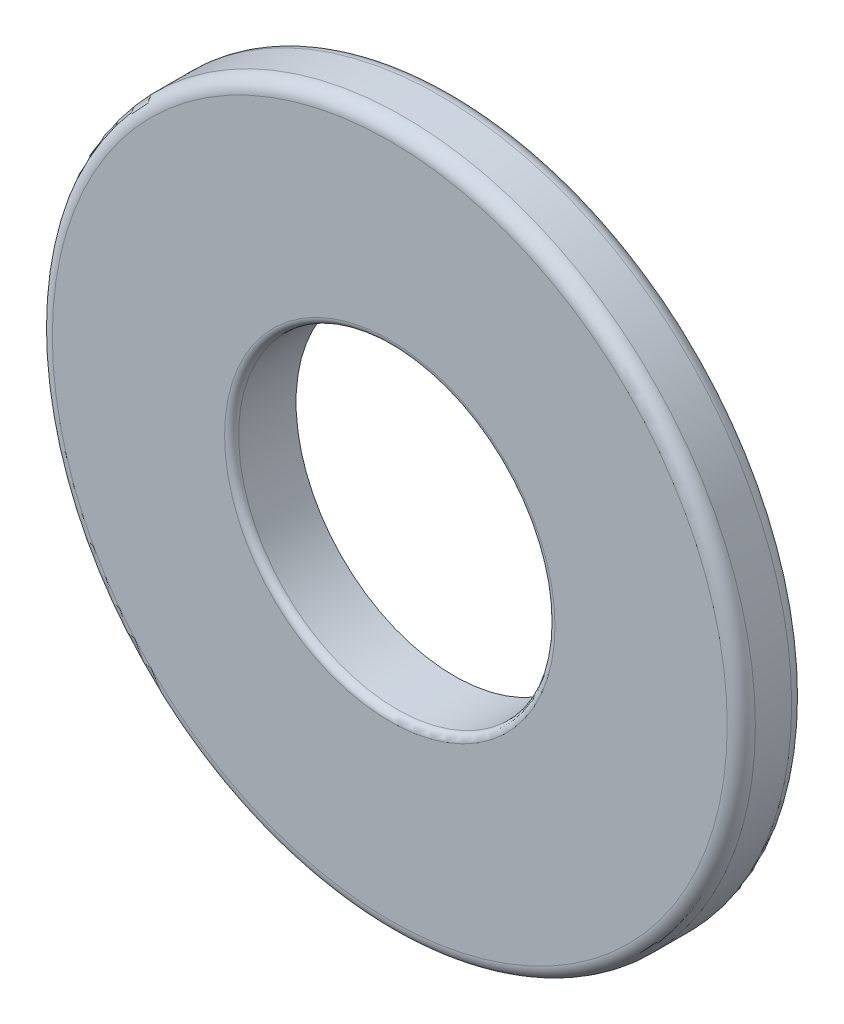
ISO-10303-21;
HEADER;
FILE_DESCRIPTION(('STEP AP214'),'2;1');
FILE_NAME('part.step','',(''),(''),'','','');
FILE_SCHEMA(('AUTOMOTIVE_DESIGN { 1 0 10303 214 1 1 1 1 }'));
ENDSEC;
DATA;
#1=APPLICATION_CONTEXT('core data for automotive mechanical design processes');
#2=APPLICATION_PROTOCOL_DEFINITION('international standard','automotive_design',2000,#1);
#3=PRODUCT_CONTEXT('',#1,'mechanical');
#4=PRODUCT('Part','Part','',(#3));
#5=PRODUCT_RELATED_PRODUCT_CATEGORY('part','',(#4));
#6=PRODUCT_DEFINITION_FORMATION('','',#4);
#7=PRODUCT_DEFINITION_CONTEXT('part definition',#1,'design');
#8=PRODUCT_DEFINITION('design','',#6,#7);
#9=PRODUCT_DEFINITION_SHAPE('','',#8);
#10=(LENGTH_UNIT() NAMED_UNIT(*) SI_UNIT(.MILLI.,.METRE.));
#11=(NAMED_UNIT(*) PLANE_ANGLE_UNIT() SI_UNIT($,.RADIAN.));
#12=(NAMED_UNIT(*) SI_UNIT($,.STERADIAN.) SOLID_ANGLE_UNIT());
#13=UNCERTAINTY_MEASURE_WITH_UNIT(LENGTH_MEASURE(1.E-05),#10,'distance_accuracy_value','');
#14=(GEOMETRIC_REPRESENTATION_CONTEXT(3) GLOBAL_UNCERTAINTY_ASSIGNED_CONTEXT((#13)) GLOBAL_UNIT_ASSIGNED_CONTEXT((#10,
#11,#12)) REPRESENTATION_CONTEXT('',''));
#15=CARTESIAN_POINT('',(0.,0.,0.));
#16=DIRECTION('',(0.,0.,1.));
#17=DIRECTION('',(1.,0.,0.));
#18=AXIS2_PLACEMENT_3D('',#15,#16,#17);
#19=CARTESIAN_POINT('',(0.,0.,-0.275));
#20=DIRECTION('',(0.,0.,1.));
#21=DIRECTION('',(1.,0.,0.));
#22=AXIS2_PLACEMENT_3D('',#19,#20,#21);
#23=CYLINDRICAL_SURFACE('',#22,3.);
#24=CARTESIAN_POINT('',(0.,0.,0.155));
#25=DIRECTION('',(0.,0.,1.));
#26=DIRECTION('',(1.,0.,0.));
#27=AXIS2_PLACEMENT_3D('',#24,#25,#26);
#28=CIRCLE('',#27,3.);
#29=CARTESIAN_POINT('',(3.,0.,0.155));
#30=VERTEX_POINT('',#29);
#31=EDGE_CURVE('E101',#30,#30,#28,.F.);
#32=ORIENTED_EDGE('',*,*,#31,.T.);
#33=EDGE_LOOP('',(#32));
#34=FACE_BOUND('',#33,.T.);
#35=CARTESIAN_POINT('',(0.,0.,-0.155));
#36=DIRECTION('',(0.,0.,1.));
#37=DIRECTION('',(1.,0.,0.));
#38=AXIS2_PLACEMENT_3D('',#35,#36,#37);
#39=CIRCLE('',#38,3.);
#40=CARTESIAN_POINT('',(3.,0.,-0.155));
#41=VERTEX_POINT('',#40);
#42=EDGE_CURVE('E107',#41,#41,#39,.T.);
#43=ORIENTED_EDGE('',*,*,#42,.T.);
#44=EDGE_LOOP('',(#43));
#45=FACE_BOUND('',#44,.T.);
#46=ADVANCED_FACE('F83',(#34,#45),#23,.T.);
#47=CARTESIAN_POINT('',(0.,0.,-0.275));
#48=DIRECTION('',(0.,0.,1.));
#49=DIRECTION('',(1.,0.,0.));
#50=AXIS2_PLACEMENT_3D('',#47,#48,#49);
#51=PLANE('',#50);
#52=CARTESIAN_POINT('',(0.,0.,-0.275));
#53=DIRECTION('',(0.,0.,1.));
#54=DIRECTION('',(1.,0.,0.));
#55=AXIS2_PLACEMENT_3D('',#52,#53,#54);
#56=CIRCLE('',#55,2.88);
#57=CARTESIAN_POINT('',(2.88,0.,-0.275));
#58=VERTEX_POINT('',#57);
#59=EDGE_CURVE('E96',#58,#58,#56,.F.);
#60=ORIENTED_EDGE('',*,*,#59,.T.);
#61=EDGE_LOOP('',(#60));
#62=FACE_BOUND('',#61,.T.);
#63=CARTESIAN_POINT('',(0.,0.,-0.275));
#64=DIRECTION('',(0.,0.,1.));
#65=DIRECTION('',(1.,0.,0.));
#66=AXIS2_PLACEMENT_3D('',#63,#64,#65);
#67=CIRCLE('',#66,1.35);
#68=CARTESIAN_POINT('',(1.35,0.,-0.275));
#69=VERTEX_POINT('',#68);
#70=EDGE_CURVE('E115',#69,#69,#67,.T.);
#71=ORIENTED_EDGE('',*,*,#70,.T.);
#72=EDGE_LOOP('',(#71));
#73=FACE_BOUND('',#72,.T.);
#74=ADVANCED_FACE('F120',(#62,#73),#51,.F.);
#75=CARTESIAN_POINT('',(0.,0.,-0.275));
#76=DIRECTION('',(0.,0.,1.));
#77=DIRECTION('',(1.,0.,0.));
#78=AXIS2_PLACEMENT_3D('',#75,#76,#77);
#79=CYLINDRICAL_SURFACE('',#78,1.35);
#80=CARTESIAN_POINT('',(0.,0.,0.215));
#81=DIRECTION('',(0.,0.,1.));
#82=DIRECTION('',(1.,0.,0.));
#83=AXIS2_PLACEMENT_3D('',#80,#81,#82);
#84=CIRCLE('',#83,1.35);
#85=CARTESIAN_POINT('',(1.35,0.,0.215));
#86=VERTEX_POINT('',#85);
#87=EDGE_CURVE('E91',#86,#86,#84,.T.);
#88=ORIENTED_EDGE('',*,*,#87,.T.);
#89=EDGE_LOOP('',(#88));
#90=FACE_BOUND('',#89,.T.);
#91=ORIENTED_EDGE('',*,*,#70,.F.);
#92=EDGE_LOOP('',(#91));
#93=FACE_BOUND('',#92,.T.);
#94=ADVANCED_FACE('F122',(#90,#93),#79,.F.);
#95=CARTESIAN_POINT('',(0.,0.,0.275));
#96=DIRECTION('',(0.,0.,1.));
#97=DIRECTION('',(1.,0.,0.));
#98=AXIS2_PLACEMENT_3D('',#95,#96,#97);
#99=PLANE('',#98);
#100=CARTESIAN_POINT('',(0.,0.,0.275));
#101=DIRECTION('',(0.,0.,1.));
#102=DIRECTION('',(1.,0.,0.));
#103=AXIS2_PLACEMENT_3D('',#100,#101,#102);
#104=CIRCLE('',#103,1.41);
#105=CARTESIAN_POINT('',(1.41,0.,0.275));
#106=VERTEX_POINT('',#105);
#107=EDGE_CURVE('E11',#106,#106,#104,.F.);
#108=ORIENTED_EDGE('',*,*,#107,.T.);
#109=EDGE_LOOP('',(#108));
#110=FACE_BOUND('',#109,.T.);
#111=CARTESIAN_POINT('',(0.,0.,0.275));
#112=DIRECTION('',(0.,0.,1.));
#113=DIRECTION('',(1.,0.,0.));
#114=AXIS2_PLACEMENT_3D('',#111,#112,#113);
#115=CIRCLE('',#114,2.88);
#116=CARTESIAN_POINT('',(2.88,0.,0.275));
#117=VERTEX_POINT('',#116);
#118=EDGE_CURVE('E111',#117,#117,#115,.T.);
#119=ORIENTED_EDGE('',*,*,#118,.T.);
#120=EDGE_LOOP('',(#119));
#121=FACE_BOUND('',#120,.T.);
#122=ADVANCED_FACE('F124',(#110,#121),#99,.T.);
#123=CARTESIAN_POINT('',(0.,0.,0.155));
#124=DIRECTION('',(0.,0.,1.));
#125=DIRECTION('',(1.,0.,0.));
#126=AXIS2_PLACEMENT_3D('',#123,#124,#125);
#127=TOROIDAL_SURFACE('',#126,2.88,0.12);
#128=ORIENTED_EDGE('',*,*,#31,.F.);
#129=EDGE_LOOP('',(#128));
#130=FACE_BOUND('',#129,.T.);
#131=ORIENTED_EDGE('',*,*,#118,.F.);
#132=EDGE_LOOP('',(#131));
#133=FACE_BOUND('',#132,.T.);
#134=ADVANCED_FACE('F130',(#130,#133),#127,.T.);
#135=CARTESIAN_POINT('',(0.,0.,-0.155));
#136=DIRECTION('',(0.,0.,1.));
#137=DIRECTION('',(1.,0.,0.));
#138=AXIS2_PLACEMENT_3D('',#135,#136,#137);
#139=TOROIDAL_SURFACE('',#138,2.88,0.12);
#140=ORIENTED_EDGE('',*,*,#59,.F.);
#141=EDGE_LOOP('',(#140));
#142=FACE_BOUND('',#141,.T.);
#143=ORIENTED_EDGE('',*,*,#42,.F.);
#144=EDGE_LOOP('',(#143));
#145=FACE_BOUND('',#144,.T.);
#146=ADVANCED_FACE('F142',(#142,#145),#139,.T.);
#147=CARTESIAN_POINT('',(0.,0.,0.215));
#148=DIRECTION('',(0.,0.,1.));
#149=DIRECTION('',(1.,0.,0.));
#150=AXIS2_PLACEMENT_3D('',#147,#148,#149);
#151=TOROIDAL_SURFACE('',#150,1.41,0.06);
#152=ORIENTED_EDGE('',*,*,#107,.F.);
#153=EDGE_LOOP('',(#152));
#154=FACE_BOUND('',#153,.T.);
#155=ORIENTED_EDGE('',*,*,#87,.F.);
#156=EDGE_LOOP('',(#155));
#157=FACE_BOUND('',#156,.T.);
#158=ADVANCED_FACE('F85',(#154,#157),#151,.T.);
#159=CLOSED_SHELL('',(#46,#74,#94,#122,#134,#146,#158));
#160=MANIFOLD_SOLID_BREP('B2',#159);
#161=ADVANCED_BREP_SHAPE_REPRESENTATION('',(#18,#160),#14);
#162=SHAPE_DEFINITION_REPRESENTATION(#9,#161);
ENDSEC;
END-ISO-10303-21;
